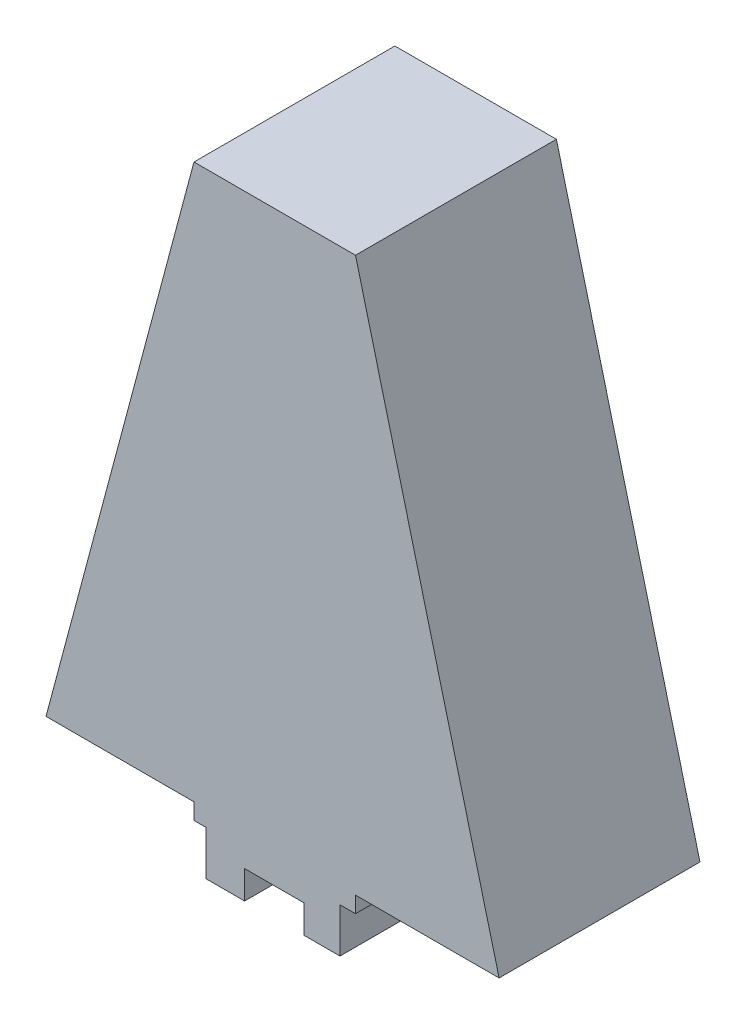
ISO-10303-21;
HEADER;
FILE_DESCRIPTION(('STEP AP214'),'2;1');
FILE_NAME('part.step','',(''),(''),'','','');
FILE_SCHEMA(('AUTOMOTIVE_DESIGN { 1 0 10303 214 1 1 1 1 }'));
ENDSEC;
DATA;
#1=APPLICATION_CONTEXT('core data for automotive mechanical design processes');
#2=APPLICATION_PROTOCOL_DEFINITION('international standard','automotive_design',2000,#1);
#3=PRODUCT_CONTEXT('',#1,'mechanical');
#4=PRODUCT('Part','Part','',(#3));
#5=PRODUCT_RELATED_PRODUCT_CATEGORY('part','',(#4));
#6=PRODUCT_DEFINITION_FORMATION('','',#4);
#7=PRODUCT_DEFINITION_CONTEXT('part definition',#1,'design');
#8=PRODUCT_DEFINITION('design','',#6,#7);
#9=PRODUCT_DEFINITION_SHAPE('','',#8);
#10=(LENGTH_UNIT() NAMED_UNIT(*) SI_UNIT(.MILLI.,.METRE.));
#11=(NAMED_UNIT(*) PLANE_ANGLE_UNIT() SI_UNIT($,.RADIAN.));
#12=(NAMED_UNIT(*) SI_UNIT($,.STERADIAN.) SOLID_ANGLE_UNIT());
#13=UNCERTAINTY_MEASURE_WITH_UNIT(LENGTH_MEASURE(1.E-05),#10,'distance_accuracy_value','');
#14=(GEOMETRIC_REPRESENTATION_CONTEXT(3) GLOBAL_UNCERTAINTY_ASSIGNED_CONTEXT((#13)) GLOBAL_UNIT_ASSIGNED_CONTEXT((#10,
#11,#12)) REPRESENTATION_CONTEXT('',''));
#15=CARTESIAN_POINT('',(0.,0.,0.));
#16=DIRECTION('',(0.,0.,1.));
#17=DIRECTION('',(1.,0.,0.));
#18=AXIS2_PLACEMENT_3D('',#15,#16,#17);
#19=CARTESIAN_POINT('',(-0.0284136292738602,-0.0689597783090079,0.025));
#20=DIRECTION('',(0.966149934609017,-0.257981208336949,0.));
#21=DIRECTION('',(0.257981208336949,0.966149934609017,0.));
#22=AXIS2_PLACEMENT_3D('',#19,#20,#21);
#23=PLANE('',#22);
#24=DIRECTION('',(-0.257981208336949,-0.966149934609017,0.));
#25=VECTOR('',#24,1.);
#26=CARTESIAN_POINT('',(-0.0284136292738602,-0.0689597783090079,0.));
#27=LINE('',#26,#25);
#28=CARTESIAN_POINT('',(-0.00999999977648258,0.,0.));
#29=VERTEX_POINT('',#28);
#30=CARTESIAN_POINT('',(-0.0284136292738602,-0.0689597783090079,0.));
#31=VERTEX_POINT('',#30);
#32=EDGE_CURVE('E183',#29,#31,#27,.T.);
#33=ORIENTED_EDGE('',*,*,#32,.T.);
#34=DIRECTION('',(0.,0.,-1.));
#35=VECTOR('',#34,1.);
#36=CARTESIAN_POINT('',(-0.0284136292738602,-0.0689597783090079,0.025));
#37=LINE('',#36,#35);
#38=CARTESIAN_POINT('',(-0.0284136292738602,-0.0689597783090079,0.025));
#39=VERTEX_POINT('',#38);
#40=EDGE_CURVE('E11',#39,#31,#37,.T.);
#41=ORIENTED_EDGE('',*,*,#40,.F.);
#42=DIRECTION('',(-0.257981208336949,-0.966149934609017,0.));
#43=VECTOR('',#42,1.);
#44=CARTESIAN_POINT('',(-0.0284136292738602,-0.0689597783090079,0.025));
#45=LINE('',#44,#43);
#46=CARTESIAN_POINT('',(-0.00999999977648258,0.,0.025));
#47=VERTEX_POINT('',#46);
#48=EDGE_CURVE('E215',#47,#39,#45,.T.);
#49=ORIENTED_EDGE('',*,*,#48,.F.);
#50=DIRECTION('',(0.,0.,-1.));
#51=VECTOR('',#50,1.);
#52=CARTESIAN_POINT('',(-0.00999999977648258,0.,0.025));
#53=LINE('',#52,#51);
#54=EDGE_CURVE('E179',#47,#29,#53,.T.);
#55=ORIENTED_EDGE('',*,*,#54,.T.);
#56=EDGE_LOOP('',(#33,#41,#49,#55));
#57=FACE_BOUND('',#56,.T.);
#58=ADVANCED_FACE('F39',(#57),#23,.F.);
#59=CARTESIAN_POINT('',(-0.00999999977648258,-0.0689597783090079,0.025));
#60=DIRECTION('',(0.,1.,0.));
#61=DIRECTION('',(0.,0.,1.));
#62=AXIS2_PLACEMENT_3D('',#59,#60,#61);
#63=PLANE('',#62);
#64=DIRECTION('',(1.,0.,0.));
#65=VECTOR('',#64,1.);
#66=CARTESIAN_POINT('',(-0.00999999977648258,-0.0689597783090079,0.));
#67=LINE('',#66,#65);
#68=CARTESIAN_POINT('',(-0.00999999977648258,-0.0689597783090079,0.));
#69=VERTEX_POINT('',#68);
#70=EDGE_CURVE('E186',#31,#69,#67,.T.);
#71=ORIENTED_EDGE('',*,*,#70,.T.);
#72=DIRECTION('',(0.,0.,-1.));
#73=VECTOR('',#72,1.);
#74=CARTESIAN_POINT('',(-0.00999999977648258,-0.0689597783090079,0.025));
#75=LINE('',#74,#73);
#76=CARTESIAN_POINT('',(-0.00999999977648258,-0.0689597783090079,0.025));
#77=VERTEX_POINT('',#76);
#78=EDGE_CURVE('E47',#77,#69,#75,.T.);
#79=ORIENTED_EDGE('',*,*,#78,.F.);
#80=DIRECTION('',(1.,0.,0.));
#81=VECTOR('',#80,1.);
#82=CARTESIAN_POINT('',(-0.00999999977648258,-0.0689597783090079,0.025));
#83=LINE('',#82,#81);
#84=EDGE_CURVE('E122',#39,#77,#83,.T.);
#85=ORIENTED_EDGE('',*,*,#84,.F.);
#86=ORIENTED_EDGE('',*,*,#40,.T.);
#87=EDGE_LOOP('',(#71,#79,#85,#86));
#88=FACE_BOUND('',#87,.T.);
#89=ADVANCED_FACE('F312',(#88),#63,.F.);
#90=CARTESIAN_POINT('',(-0.00999999977648258,-0.0689597783090079,0.025));
#91=DIRECTION('',(1.,0.,0.));
#92=DIRECTION('',(0.,0.,-1.));
#93=AXIS2_PLACEMENT_3D('',#90,#91,#92);
#94=PLANE('',#93);
#95=DIRECTION('',(0.,-1.,0.));
#96=VECTOR('',#95,1.);
#97=CARTESIAN_POINT('',(-0.00999999977648258,-0.0689597783090079,0.));
#98=LINE('',#97,#96);
#99=CARTESIAN_POINT('',(-0.00999999977648258,-0.0709644522570193,0.));
#100=VERTEX_POINT('',#99);
#101=EDGE_CURVE('E188',#69,#100,#98,.T.);
#102=ORIENTED_EDGE('',*,*,#101,.T.);
#103=DIRECTION('',(0.,0.,-1.));
#104=VECTOR('',#103,1.);
#105=CARTESIAN_POINT('',(-0.00999999977648258,-0.0709644522570193,0.025));
#106=LINE('',#105,#104);
#107=CARTESIAN_POINT('',(-0.00999999977648258,-0.0709644522570193,0.025));
#108=VERTEX_POINT('',#107);
#109=EDGE_CURVE('E246',#108,#100,#106,.T.);
#110=ORIENTED_EDGE('',*,*,#109,.F.);
#111=DIRECTION('',(0.,-1.,0.));
#112=VECTOR('',#111,1.);
#113=CARTESIAN_POINT('',(-0.00999999977648258,-0.0689597783090079,0.025));
#114=LINE('',#113,#112);
#115=EDGE_CURVE('E254',#77,#108,#114,.T.);
#116=ORIENTED_EDGE('',*,*,#115,.F.);
#117=ORIENTED_EDGE('',*,*,#78,.T.);
#118=EDGE_LOOP('',(#102,#110,#116,#117));
#119=FACE_BOUND('',#118,.T.);
#120=ADVANCED_FACE('F252',(#119),#94,.F.);
#121=CARTESIAN_POINT('',(-0.00999999977648258,-0.0709644522570193,0.025));
#122=DIRECTION('',(0.,1.,0.));
#123=DIRECTION('',(0.,0.,1.));
#124=AXIS2_PLACEMENT_3D('',#121,#122,#123);
#125=PLANE('',#124);
#126=DIRECTION('',(1.,0.,0.));
#127=VECTOR('',#126,1.);
#128=CARTESIAN_POINT('',(-0.00999999977648258,-0.0709644522570193,0.));
#129=LINE('',#128,#127);
#130=CARTESIAN_POINT('',(-0.008500000461936,-0.0709644522570193,0.));
#131=VERTEX_POINT('',#130);
#132=EDGE_CURVE('E190',#100,#131,#129,.T.);
#133=ORIENTED_EDGE('',*,*,#132,.T.);
#134=DIRECTION('',(0.,0.,-1.));
#135=VECTOR('',#134,1.);
#136=CARTESIAN_POINT('',(-0.008500000461936,-0.0709644522570193,0.025));
#137=LINE('',#136,#135);
#138=CARTESIAN_POINT('',(-0.008500000461936,-0.0709644522570193,0.025));
#139=VERTEX_POINT('',#138);
#140=EDGE_CURVE('E243',#139,#131,#137,.T.);
#141=ORIENTED_EDGE('',*,*,#140,.F.);
#142=DIRECTION('',(1.,0.,0.));
#143=VECTOR('',#142,1.);
#144=CARTESIAN_POINT('',(-0.00999999977648258,-0.0709644522570193,0.025));
#145=LINE('',#144,#143);
#146=EDGE_CURVE('E271',#108,#139,#145,.T.);
#147=ORIENTED_EDGE('',*,*,#146,.F.);
#148=ORIENTED_EDGE('',*,*,#109,.T.);
#149=EDGE_LOOP('',(#133,#141,#147,#148));
#150=FACE_BOUND('',#149,.T.);
#151=ADVANCED_FACE('F262',(#150),#125,.F.);
#152=CARTESIAN_POINT('',(-0.008500000461936,-0.0764999985694885,0.025));
#153=DIRECTION('',(1.,0.,0.));
#154=DIRECTION('',(0.,0.,-1.));
#155=AXIS2_PLACEMENT_3D('',#152,#153,#154);
#156=PLANE('',#155);
#157=DIRECTION('',(0.,-1.,0.));
#158=VECTOR('',#157,1.);
#159=CARTESIAN_POINT('',(-0.008500000461936,-0.0764999985694885,0.));
#160=LINE('',#159,#158);
#161=CARTESIAN_POINT('',(-0.008500000461936,-0.0764999985694885,0.));
#162=VERTEX_POINT('',#161);
#163=EDGE_CURVE('E193',#131,#162,#160,.T.);
#164=ORIENTED_EDGE('',*,*,#163,.T.);
#165=DIRECTION('',(0.,0.,-1.));
#166=VECTOR('',#165,1.);
#167=CARTESIAN_POINT('',(-0.008500000461936,-0.0764999985694885,0.025));
#168=LINE('',#167,#166);
#169=CARTESIAN_POINT('',(-0.008500000461936,-0.0764999985694885,0.025));
#170=VERTEX_POINT('',#169);
#171=EDGE_CURVE('E240',#170,#162,#168,.T.);
#172=ORIENTED_EDGE('',*,*,#171,.F.);
#173=DIRECTION('',(0.,-1.,0.));
#174=VECTOR('',#173,1.);
#175=CARTESIAN_POINT('',(-0.008500000461936,-0.0729999989271164,0.025));
#176=LINE('',#175,#174);
#177=EDGE_CURVE('E268',#139,#170,#176,.T.);
#178=ORIENTED_EDGE('',*,*,#177,.F.);
#179=ORIENTED_EDGE('',*,*,#140,.T.);
#180=EDGE_LOOP('',(#164,#172,#178,#179));
#181=FACE_BOUND('',#180,.T.);
#182=ADVANCED_FACE('F266',(#181),#156,.F.);
#183=CARTESIAN_POINT('',(-0.008500000461936,-0.0764999985694885,0.025));
#184=DIRECTION('',(0.,1.,0.));
#185=DIRECTION('',(0.,0.,1.));
#186=AXIS2_PLACEMENT_3D('',#183,#184,#185);
#187=PLANE('',#186);
#188=DIRECTION('',(1.,0.,0.));
#189=VECTOR('',#188,1.);
#190=CARTESIAN_POINT('',(-0.008500000461936,-0.0764999985694885,0.));
#191=LINE('',#190,#189);
#192=CARTESIAN_POINT('',(-0.00370000000111759,-0.0764999985694885,0.));
#193=VERTEX_POINT('',#192);
#194=EDGE_CURVE('E195',#162,#193,#191,.T.);
#195=ORIENTED_EDGE('',*,*,#194,.T.);
#196=DIRECTION('',(0.,0.,-1.));
#197=VECTOR('',#196,1.);
#198=CARTESIAN_POINT('',(-0.00370000000111759,-0.0764999985694885,0.025));
#199=LINE('',#198,#197);
#200=CARTESIAN_POINT('',(-0.00370000000111759,-0.0764999985694885,0.025));
#201=VERTEX_POINT('',#200);
#202=EDGE_CURVE('E237',#201,#193,#199,.T.);
#203=ORIENTED_EDGE('',*,*,#202,.F.);
#204=DIRECTION('',(1.,0.,0.));
#205=VECTOR('',#204,1.);
#206=CARTESIAN_POINT('',(-0.008500000461936,-0.0764999985694885,0.025));
#207=LINE('',#206,#205);
#208=EDGE_CURVE('E270',#170,#201,#207,.T.);
#209=ORIENTED_EDGE('',*,*,#208,.F.);
#210=ORIENTED_EDGE('',*,*,#171,.T.);
#211=EDGE_LOOP('',(#195,#203,#209,#210));
#212=FACE_BOUND('',#211,.T.);
#213=ADVANCED_FACE('F325',(#212),#187,.F.);
#214=CARTESIAN_POINT('',(-0.00370000000111759,-0.0764999985694885,0.025));
#215=DIRECTION('',(-1.,0.,0.));
#216=DIRECTION('',(0.,0.,1.));
#217=AXIS2_PLACEMENT_3D('',#214,#215,#216);
#218=PLANE('',#217);
#219=DIRECTION('',(0.,1.,0.));
#220=VECTOR('',#219,1.);
#221=CARTESIAN_POINT('',(-0.00370000000111759,-0.0764999985694885,0.));
#222=LINE('',#221,#220);
#223=CARTESIAN_POINT('',(-0.00370000000111759,-0.0729999989271164,0.));
#224=VERTEX_POINT('',#223);
#225=EDGE_CURVE('E197',#193,#224,#222,.T.);
#226=ORIENTED_EDGE('',*,*,#225,.T.);
#227=DIRECTION('',(0.,0.,-1.));
#228=VECTOR('',#227,1.);
#229=CARTESIAN_POINT('',(-0.00370000000111759,-0.0729999989271164,0.025));
#230=LINE('',#229,#228);
#231=CARTESIAN_POINT('',(-0.00370000000111759,-0.0729999989271164,0.025));
#232=VERTEX_POINT('',#231);
#233=EDGE_CURVE('E234',#232,#224,#230,.T.);
#234=ORIENTED_EDGE('',*,*,#233,.F.);
#235=DIRECTION('',(0.,1.,0.));
#236=VECTOR('',#235,1.);
#237=CARTESIAN_POINT('',(-0.00370000000111759,-0.0764999985694885,0.025));
#238=LINE('',#237,#236);
#239=EDGE_CURVE('E273',#201,#232,#238,.T.);
#240=ORIENTED_EDGE('',*,*,#239,.F.);
#241=ORIENTED_EDGE('',*,*,#202,.T.);
#242=EDGE_LOOP('',(#226,#234,#240,#241));
#243=FACE_BOUND('',#242,.T.);
#244=ADVANCED_FACE('F328',(#243),#218,.F.);
#245=CARTESIAN_POINT('',(-0.00370000000111759,-0.0729999989271164,0.025));
#246=DIRECTION('',(0.,1.,0.));
#247=DIRECTION('',(0.,0.,1.));
#248=AXIS2_PLACEMENT_3D('',#245,#246,#247);
#249=PLANE('',#248);
#250=DIRECTION('',(1.,0.,0.));
#251=VECTOR('',#250,1.);
#252=CARTESIAN_POINT('',(-0.00370000000111759,-0.0729999989271164,0.));
#253=LINE('',#252,#251);
#254=CARTESIAN_POINT('',(0.00370000000111759,-0.0729999989271164,0.));
#255=VERTEX_POINT('',#254);
#256=EDGE_CURVE('E199',#224,#255,#253,.T.);
#257=ORIENTED_EDGE('',*,*,#256,.T.);
#258=DIRECTION('',(0.,0.,-1.));
#259=VECTOR('',#258,1.);
#260=CARTESIAN_POINT('',(0.00370000000111759,-0.0729999989271164,0.025));
#261=LINE('',#260,#259);
#262=CARTESIAN_POINT('',(0.00370000000111759,-0.0729999989271164,0.025));
#263=VERTEX_POINT('',#262);
#264=EDGE_CURVE('E231',#263,#255,#261,.T.);
#265=ORIENTED_EDGE('',*,*,#264,.F.);
#266=DIRECTION('',(1.,0.,0.));
#267=VECTOR('',#266,1.);
#268=CARTESIAN_POINT('',(-0.00370000000111759,-0.0729999989271164,0.025));
#269=LINE('',#268,#267);
#270=EDGE_CURVE('E279',#232,#263,#269,.T.);
#271=ORIENTED_EDGE('',*,*,#270,.F.);
#272=ORIENTED_EDGE('',*,*,#233,.T.);
#273=EDGE_LOOP('',(#257,#265,#271,#272));
#274=FACE_BOUND('',#273,.T.);
#275=ADVANCED_FACE('F332',(#274),#249,.F.);
#276=CARTESIAN_POINT('',(0.00370000000111759,-0.0764999985694885,0.025));
#277=DIRECTION('',(1.,0.,0.));
#278=DIRECTION('',(0.,0.,-1.));
#279=AXIS2_PLACEMENT_3D('',#276,#277,#278);
#280=PLANE('',#279);
#281=DIRECTION('',(0.,-1.,0.));
#282=VECTOR('',#281,1.);
#283=CARTESIAN_POINT('',(0.00370000000111759,-0.0764999985694885,0.));
#284=LINE('',#283,#282);
#285=CARTESIAN_POINT('',(0.00370000000111759,-0.0764999985694885,0.));
#286=VERTEX_POINT('',#285);
#287=EDGE_CURVE('E201',#255,#286,#284,.T.);
#288=ORIENTED_EDGE('',*,*,#287,.T.);
#289=DIRECTION('',(0.,0.,-1.));
#290=VECTOR('',#289,1.);
#291=CARTESIAN_POINT('',(0.00370000000111759,-0.0764999985694885,0.025));
#292=LINE('',#291,#290);
#293=CARTESIAN_POINT('',(0.00370000000111759,-0.0764999985694885,0.025));
#294=VERTEX_POINT('',#293);
#295=EDGE_CURVE('E228',#294,#286,#292,.T.);
#296=ORIENTED_EDGE('',*,*,#295,.F.);
#297=DIRECTION('',(0.,-1.,0.));
#298=VECTOR('',#297,1.);
#299=CARTESIAN_POINT('',(0.00370000000111759,-0.0764999985694885,0.025));
#300=LINE('',#299,#298);
#301=EDGE_CURVE('E281',#263,#294,#300,.T.);
#302=ORIENTED_EDGE('',*,*,#301,.F.);
#303=ORIENTED_EDGE('',*,*,#264,.T.);
#304=EDGE_LOOP('',(#288,#296,#302,#303));
#305=FACE_BOUND('',#304,.T.);
#306=ADVANCED_FACE('F336',(#305),#280,.F.);
#307=CARTESIAN_POINT('',(0.00370000000111759,-0.0764999985694885,0.025));
#308=DIRECTION('',(0.,1.,0.));
#309=DIRECTION('',(0.,0.,1.));
#310=AXIS2_PLACEMENT_3D('',#307,#308,#309);
#311=PLANE('',#310);
#312=DIRECTION('',(1.,0.,0.));
#313=VECTOR('',#312,1.);
#314=CARTESIAN_POINT('',(0.00370000000111759,-0.0764999985694885,0.));
#315=LINE('',#314,#313);
#316=CARTESIAN_POINT('',(0.00816518366467289,-0.0764999985694885,0.));
#317=VERTEX_POINT('',#316);
#318=EDGE_CURVE('E203',#286,#317,#315,.T.);
#319=ORIENTED_EDGE('',*,*,#318,.T.);
#320=DIRECTION('',(0.,0.,-1.));
#321=VECTOR('',#320,1.);
#322=CARTESIAN_POINT('',(0.00816518366467289,-0.0764999985694885,0.025));
#323=LINE('',#322,#321);
#324=CARTESIAN_POINT('',(0.00816518366467289,-0.0764999985694885,0.025));
#325=VERTEX_POINT('',#324);
#326=EDGE_CURVE('E225',#325,#317,#323,.T.);
#327=ORIENTED_EDGE('',*,*,#326,.F.);
#328=DIRECTION('',(1.,0.,0.));
#329=VECTOR('',#328,1.);
#330=CARTESIAN_POINT('',(0.00370000000111759,-0.0764999985694885,0.025));
#331=LINE('',#330,#329);
#332=EDGE_CURVE('E283',#294,#325,#331,.T.);
#333=ORIENTED_EDGE('',*,*,#332,.F.);
#334=ORIENTED_EDGE('',*,*,#295,.T.);
#335=EDGE_LOOP('',(#319,#327,#333,#334));
#336=FACE_BOUND('',#335,.T.);
#337=ADVANCED_FACE('F340',(#336),#311,.F.);
#338=CARTESIAN_POINT('',(0.00816518366467289,-0.0729999989271164,0.025));
#339=DIRECTION('',(-1.,0.,0.));
#340=DIRECTION('',(0.,0.,1.));
#341=AXIS2_PLACEMENT_3D('',#338,#339,#340);
#342=PLANE('',#341);
#343=DIRECTION('',(0.,1.,0.));
#344=VECTOR('',#343,1.);
#345=CARTESIAN_POINT('',(0.00816518366467289,-0.0729999989271164,0.));
#346=LINE('',#345,#344);
#347=CARTESIAN_POINT('',(0.00816518366467289,-0.0709644522570193,0.));
#348=VERTEX_POINT('',#347);
#349=EDGE_CURVE('E206',#317,#348,#346,.T.);
#350=ORIENTED_EDGE('',*,*,#349,.T.);
#351=DIRECTION('',(0.,0.,-1.));
#352=VECTOR('',#351,1.);
#353=CARTESIAN_POINT('',(0.00816518366467289,-0.0709644522570193,0.025));
#354=LINE('',#353,#352);
#355=CARTESIAN_POINT('',(0.00816518366467289,-0.0709644522570193,0.025));
#356=VERTEX_POINT('',#355);
#357=EDGE_CURVE('E222',#356,#348,#354,.T.);
#358=ORIENTED_EDGE('',*,*,#357,.F.);
#359=DIRECTION('',(0.,1.,0.));
#360=VECTOR('',#359,1.);
#361=CARTESIAN_POINT('',(0.00816518366467289,-0.0764999985694885,0.025));
#362=LINE('',#361,#360);
#363=EDGE_CURVE('E285',#325,#356,#362,.T.);
#364=ORIENTED_EDGE('',*,*,#363,.F.);
#365=ORIENTED_EDGE('',*,*,#326,.T.);
#366=EDGE_LOOP('',(#350,#358,#364,#365));
#367=FACE_BOUND('',#366,.T.);
#368=ADVANCED_FACE('F344',(#367),#342,.F.);
#369=CARTESIAN_POINT('',(0.00816518366467289,-0.0709644522570193,0.025));
#370=DIRECTION('',(0.,1.,0.));
#371=DIRECTION('',(0.,0.,1.));
#372=AXIS2_PLACEMENT_3D('',#369,#370,#371);
#373=PLANE('',#372);
#374=DIRECTION('',(1.,0.,0.));
#375=VECTOR('',#374,1.);
#376=CARTESIAN_POINT('',(0.00816518366467289,-0.0709644522570193,0.));
#377=LINE('',#376,#375);
#378=CARTESIAN_POINT('',(0.0100990429536744,-0.0709644522570193,0.));
#379=VERTEX_POINT('',#378);
#380=EDGE_CURVE('E208',#348,#379,#377,.T.);
#381=ORIENTED_EDGE('',*,*,#380,.T.);
#382=DIRECTION('',(0.,0.,-1.));
#383=VECTOR('',#382,1.);
#384=CARTESIAN_POINT('',(0.0100990429536744,-0.0709644522570193,0.025));
#385=LINE('',#384,#383);
#386=CARTESIAN_POINT('',(0.0100990429536744,-0.0709644522570193,0.025));
#387=VERTEX_POINT('',#386);
#388=EDGE_CURVE('E219',#387,#379,#385,.T.);
#389=ORIENTED_EDGE('',*,*,#388,.F.);
#390=DIRECTION('',(1.,0.,0.));
#391=VECTOR('',#390,1.);
#392=CARTESIAN_POINT('',(0.00816518366467289,-0.0709644522570193,0.025));
#393=LINE('',#392,#391);
#394=EDGE_CURVE('E287',#356,#387,#393,.T.);
#395=ORIENTED_EDGE('',*,*,#394,.F.);
#396=ORIENTED_EDGE('',*,*,#357,.T.);
#397=EDGE_LOOP('',(#381,#389,#395,#396));
#398=FACE_BOUND('',#397,.T.);
#399=ADVANCED_FACE('F293',(#398),#373,.F.);
#400=CARTESIAN_POINT('',(0.0100990429536744,-0.0689597783090079,0.025));
#401=DIRECTION('',(-1.,0.,0.));
#402=DIRECTION('',(0.,0.,1.));
#403=AXIS2_PLACEMENT_3D('',#400,#401,#402);
#404=PLANE('',#403);
#405=DIRECTION('',(0.,1.,0.));
#406=VECTOR('',#405,1.);
#407=CARTESIAN_POINT('',(0.0100990429536744,-0.0689597783090079,0.));
#408=LINE('',#407,#406);
#409=CARTESIAN_POINT('',(0.0100990429536744,-0.0689597783090079,0.));
#410=VERTEX_POINT('',#409);
#411=EDGE_CURVE('E210',#379,#410,#408,.T.);
#412=ORIENTED_EDGE('',*,*,#411,.T.);
#413=DIRECTION('',(0.,0.,-1.));
#414=VECTOR('',#413,1.);
#415=CARTESIAN_POINT('',(0.0100990429536744,-0.0689597783090079,0.025));
#416=LINE('',#415,#414);
#417=CARTESIAN_POINT('',(0.0100990429536744,-0.0689597783090079,0.025));
#418=VERTEX_POINT('',#417);
#419=EDGE_CURVE('E174',#418,#410,#416,.T.);
#420=ORIENTED_EDGE('',*,*,#419,.F.);
#421=DIRECTION('',(0.,1.,0.));
#422=VECTOR('',#421,1.);
#423=CARTESIAN_POINT('',(0.0100990429536744,-0.0689597783090079,0.025));
#424=LINE('',#423,#422);
#425=EDGE_CURVE('E165',#387,#418,#424,.T.);
#426=ORIENTED_EDGE('',*,*,#425,.F.);
#427=ORIENTED_EDGE('',*,*,#388,.T.);
#428=EDGE_LOOP('',(#412,#420,#426,#427));
#429=FACE_BOUND('',#428,.T.);
#430=ADVANCED_FACE('F297',(#429),#404,.F.);
#431=CARTESIAN_POINT('',(0.0100990429536744,-0.0689597783090079,0.025));
#432=DIRECTION('',(0.,1.,0.));
#433=DIRECTION('',(0.,0.,1.));
#434=AXIS2_PLACEMENT_3D('',#431,#432,#433);
#435=PLANE('',#434);
#436=DIRECTION('',(1.,0.,0.));
#437=VECTOR('',#436,1.);
#438=CARTESIAN_POINT('',(0.0100990429536744,-0.0689597783090079,0.));
#439=LINE('',#438,#437);
#440=CARTESIAN_POINT('',(0.027969051758725,-0.0689597783090079,0.));
#441=VERTEX_POINT('',#440);
#442=EDGE_CURVE('E173',#410,#441,#439,.T.);
#443=ORIENTED_EDGE('',*,*,#442,.T.);
#444=DIRECTION('',(0.,0.,-1.));
#445=VECTOR('',#444,1.);
#446=CARTESIAN_POINT('',(0.027969051758725,-0.0689597783090079,0.025));
#447=LINE('',#446,#445);
#448=CARTESIAN_POINT('',(0.027969051758725,-0.0689597783090079,0.025));
#449=VERTEX_POINT('',#448);
#450=EDGE_CURVE('E170',#449,#441,#447,.T.);
#451=ORIENTED_EDGE('',*,*,#450,.F.);
#452=DIRECTION('',(1.,0.,0.));
#453=VECTOR('',#452,1.);
#454=CARTESIAN_POINT('',(0.0100990429536744,-0.0689597783090079,0.025));
#455=LINE('',#454,#453);
#456=EDGE_CURVE('E159',#418,#449,#455,.T.);
#457=ORIENTED_EDGE('',*,*,#456,.F.);
#458=ORIENTED_EDGE('',*,*,#419,.T.);
#459=EDGE_LOOP('',(#443,#451,#457,#458));
#460=FACE_BOUND('',#459,.T.);
#461=ADVANCED_FACE('F171',(#460),#435,.F.);
#462=CARTESIAN_POINT('',(0.027969051758725,-0.0689597783090079,0.025));
#463=DIRECTION('',(-0.968025715165173,-0.250850981219837,0.));
#464=DIRECTION('',(0.250850981219837,-0.968025715165173,0.));
#465=AXIS2_PLACEMENT_3D('',#462,#463,#464);
#466=PLANE('',#465);
#467=DIRECTION('',(-0.250850981219837,0.968025715165173,0.));
#468=VECTOR('',#467,1.);
#469=CARTESIAN_POINT('',(0.027969051758725,-0.0689597783090079,0.));
#470=LINE('',#469,#468);
#471=CARTESIAN_POINT('',(0.0100990429536744,0.,0.));
#472=VERTEX_POINT('',#471);
#473=EDGE_CURVE('E108',#441,#472,#470,.T.);
#474=ORIENTED_EDGE('',*,*,#473,.T.);
#475=DIRECTION('',(0.,0.,-1.));
#476=VECTOR('',#475,1.);
#477=CARTESIAN_POINT('',(0.0100990429536744,0.,0.025));
#478=LINE('',#477,#476);
#479=CARTESIAN_POINT('',(0.0100990429536744,0.,0.025));
#480=VERTEX_POINT('',#479);
#481=EDGE_CURVE('E175',#480,#472,#478,.T.);
#482=ORIENTED_EDGE('',*,*,#481,.F.);
#483=DIRECTION('',(-0.250850981219837,0.968025715165173,0.));
#484=VECTOR('',#483,1.);
#485=CARTESIAN_POINT('',(0.027969051758725,-0.0689597783090079,0.025));
#486=LINE('',#485,#484);
#487=EDGE_CURVE('E163',#449,#480,#486,.T.);
#488=ORIENTED_EDGE('',*,*,#487,.F.);
#489=ORIENTED_EDGE('',*,*,#450,.T.);
#490=EDGE_LOOP('',(#474,#482,#488,#489));
#491=FACE_BOUND('',#490,.T.);
#492=ADVANCED_FACE('F177',(#491),#466,.F.);
#493=CARTESIAN_POINT('',(-0.00999999977648258,0.,0.025));
#494=DIRECTION('',(0.,-1.,0.));
#495=DIRECTION('',(0.,0.,-1.));
#496=AXIS2_PLACEMENT_3D('',#493,#494,#495);
#497=PLANE('',#496);
#498=DIRECTION('',(-1.,0.,0.));
#499=VECTOR('',#498,1.);
#500=CARTESIAN_POINT('',(-0.00999999977648258,0.,0.));
#501=LINE('',#500,#499);
#502=EDGE_CURVE('E114',#472,#29,#501,.T.);
#503=ORIENTED_EDGE('',*,*,#502,.T.);
#504=ORIENTED_EDGE('',*,*,#54,.F.);
#505=DIRECTION('',(-1.,0.,0.));
#506=VECTOR('',#505,1.);
#507=CARTESIAN_POINT('',(-0.00999999977648258,0.,0.025));
#508=LINE('',#507,#506);
#509=EDGE_CURVE('E55',#480,#47,#508,.T.);
#510=ORIENTED_EDGE('',*,*,#509,.F.);
#511=ORIENTED_EDGE('',*,*,#481,.T.);
#512=EDGE_LOOP('',(#503,#504,#510,#511));
#513=FACE_BOUND('',#512,.T.);
#514=ADVANCED_FACE('F301',(#513),#497,.F.);
#515=CARTESIAN_POINT('',(0.,0.,0.025));
#516=DIRECTION('',(0.,0.,-1.));
#517=DIRECTION('',(-1.,0.,0.));
#518=AXIS2_PLACEMENT_3D('',#515,#516,#517);
#519=PLANE('',#518);
#520=ORIENTED_EDGE('',*,*,#48,.T.);
#521=ORIENTED_EDGE('',*,*,#84,.T.);
#522=ORIENTED_EDGE('',*,*,#115,.T.);
#523=ORIENTED_EDGE('',*,*,#146,.T.);
#524=ORIENTED_EDGE('',*,*,#177,.T.);
#525=ORIENTED_EDGE('',*,*,#208,.T.);
#526=ORIENTED_EDGE('',*,*,#239,.T.);
#527=ORIENTED_EDGE('',*,*,#270,.T.);
#528=ORIENTED_EDGE('',*,*,#301,.T.);
#529=ORIENTED_EDGE('',*,*,#332,.T.);
#530=ORIENTED_EDGE('',*,*,#363,.T.);
#531=ORIENTED_EDGE('',*,*,#394,.T.);
#532=ORIENTED_EDGE('',*,*,#425,.T.);
#533=ORIENTED_EDGE('',*,*,#456,.T.);
#534=ORIENTED_EDGE('',*,*,#487,.T.);
#535=ORIENTED_EDGE('',*,*,#509,.T.);
#536=EDGE_LOOP('',(#520,#521,#522,#523,#524,#525,#526,#527,#528,#529,#530,#531,#532,#533,#534,#535));
#537=FACE_BOUND('',#536,.T.);
#538=ADVANCED_FACE('F161',(#537),#519,.F.);
#539=CARTESIAN_POINT('',(0.,0.,0.));
#540=DIRECTION('',(0.,0.,-1.));
#541=DIRECTION('',(-1.,0.,0.));
#542=AXIS2_PLACEMENT_3D('',#539,#540,#541);
#543=PLANE('',#542);
#544=ORIENTED_EDGE('',*,*,#32,.F.);
#545=ORIENTED_EDGE('',*,*,#502,.F.);
#546=ORIENTED_EDGE('',*,*,#473,.F.);
#547=ORIENTED_EDGE('',*,*,#442,.F.);
#548=ORIENTED_EDGE('',*,*,#411,.F.);
#549=ORIENTED_EDGE('',*,*,#380,.F.);
#550=ORIENTED_EDGE('',*,*,#349,.F.);
#551=ORIENTED_EDGE('',*,*,#318,.F.);
#552=ORIENTED_EDGE('',*,*,#287,.F.);
#553=ORIENTED_EDGE('',*,*,#256,.F.);
#554=ORIENTED_EDGE('',*,*,#225,.F.);
#555=ORIENTED_EDGE('',*,*,#194,.F.);
#556=ORIENTED_EDGE('',*,*,#163,.F.);
#557=ORIENTED_EDGE('',*,*,#132,.F.);
#558=ORIENTED_EDGE('',*,*,#101,.F.);
#559=ORIENTED_EDGE('',*,*,#70,.F.);
#560=EDGE_LOOP('',(#544,#545,#546,#547,#548,#549,#550,#551,#552,#553,#554,#555,#556,#557,#558,#559));
#561=FACE_BOUND('',#560,.T.);
#562=ADVANCED_FACE('F258',(#561),#543,.T.);
#563=CLOSED_SHELL('',(#58,#89,#120,#151,#182,#213,#244,#275,#306,#337,#368,#399,#430,#461,#492,
#514,#538,#562));
#564=MANIFOLD_SOLID_BREP('B2',#563);
#565=ADVANCED_BREP_SHAPE_REPRESENTATION('',(#18,#564),#14);
#566=SHAPE_DEFINITION_REPRESENTATION(#9,#565);
ENDSEC;
END-ISO-10303-21;
